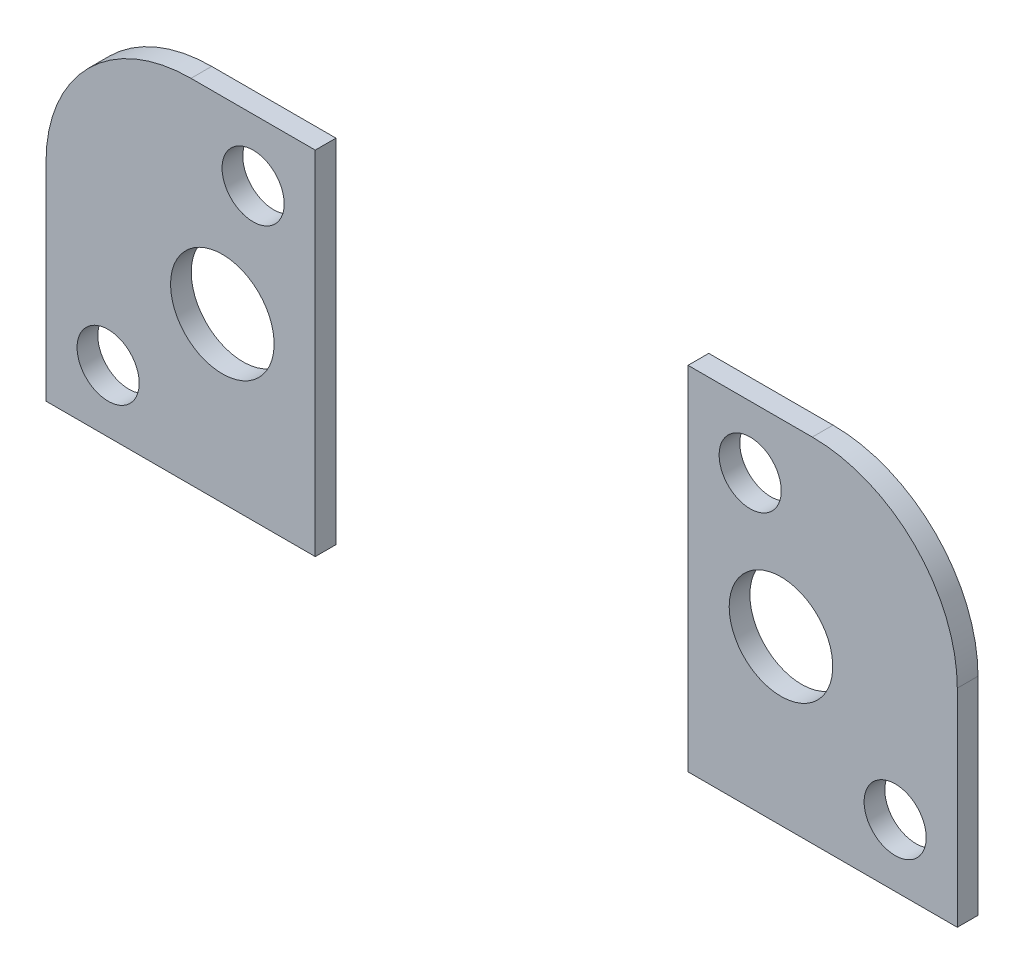
ISO-10303-21;
HEADER;
FILE_DESCRIPTION(('STEP AP214'),'2;1');
FILE_NAME('part.step','',(''),(''),'','','');
FILE_SCHEMA(('AUTOMOTIVE_DESIGN { 1 0 10303 214 1 1 1 1 }'));
ENDSEC;
DATA;
#1=APPLICATION_CONTEXT('core data for automotive mechanical design processes');
#2=APPLICATION_PROTOCOL_DEFINITION('international standard','automotive_design',2000,#1);
#3=PRODUCT_CONTEXT('',#1,'mechanical');
#4=PRODUCT('Part','Part','',(#3));
#5=PRODUCT_RELATED_PRODUCT_CATEGORY('part','',(#4));
#6=PRODUCT_DEFINITION_FORMATION('','',#4);
#7=PRODUCT_DEFINITION_CONTEXT('part definition',#1,'design');
#8=PRODUCT_DEFINITION('design','',#6,#7);
#9=PRODUCT_DEFINITION_SHAPE('','',#8);
#10=(LENGTH_UNIT() NAMED_UNIT(*) SI_UNIT(.MILLI.,.METRE.));
#11=(NAMED_UNIT(*) PLANE_ANGLE_UNIT() SI_UNIT($,.RADIAN.));
#12=(NAMED_UNIT(*) SI_UNIT($,.STERADIAN.) SOLID_ANGLE_UNIT());
#13=UNCERTAINTY_MEASURE_WITH_UNIT(LENGTH_MEASURE(1.E-05),#10,'distance_accuracy_value','');
#14=(GEOMETRIC_REPRESENTATION_CONTEXT(3) GLOBAL_UNCERTAINTY_ASSIGNED_CONTEXT((#13)) GLOBAL_UNIT_ASSIGNED_CONTEXT((#10,
#11,#12)) REPRESENTATION_CONTEXT('',''));
#15=CARTESIAN_POINT('',(0.,0.,0.));
#16=DIRECTION('',(0.,0.,1.));
#17=DIRECTION('',(1.,0.,0.));
#18=AXIS2_PLACEMENT_3D('',#15,#16,#17);
#19=CARTESIAN_POINT('',(-14.6273183885863,0.329507902749218,992.809706350788));
#20=DIRECTION('',(0.,0.,-1.));
#21=DIRECTION('',(-1.,0.,0.));
#22=AXIS2_PLACEMENT_3D('',#19,#20,#21);
#23=PLANE('',#22);
#24=CARTESIAN_POINT('',(-11.6273183885863,4.32950790274922,992.809706350788));
#25=DIRECTION('',(0.,0.,-1.));
#26=DIRECTION('',(-1.,0.,0.));
#27=AXIS2_PLACEMENT_3D('',#24,#25,#26);
#28=CIRCLE('',#27,1.5);
#29=CARTESIAN_POINT('',(-13.1273183885863,4.32950790274922,992.809706350788));
#30=VERTEX_POINT('',#29);
#31=EDGE_CURVE('E145',#30,#30,#28,.T.);
#32=ORIENTED_EDGE('',*,*,#31,.F.);
#33=EDGE_LOOP('',(#32));
#34=FACE_BOUND('',#33,.T.);
#35=DIRECTION('',(1.,0.,0.));
#36=VECTOR('',#35,1.);
#37=CARTESIAN_POINT('',(-14.6273183885863,7.32950790274922,992.809706350788));
#38=LINE('',#37,#36);
#39=CARTESIAN_POINT('',(-14.6273183885863,7.32950790274922,992.809706350788));
#40=VERTEX_POINT('',#39);
#41=CARTESIAN_POINT('',(-8.62731838858626,7.32950790274922,992.809706350788));
#42=VERTEX_POINT('',#41);
#43=EDGE_CURVE('E125',#40,#42,#38,.T.);
#44=ORIENTED_EDGE('',*,*,#43,.T.);
#45=DIRECTION('',(0.,-1.,0.));
#46=VECTOR('',#45,1.);
#47=CARTESIAN_POINT('',(-8.62731838858626,7.32950790274922,992.809706350788));
#48=LINE('',#47,#46);
#49=CARTESIAN_POINT('',(-8.62731838858626,-9.67049209725079,992.809706350788));
#50=VERTEX_POINT('',#49);
#51=EDGE_CURVE('E87',#42,#50,#48,.T.);
#52=ORIENTED_EDGE('',*,*,#51,.T.);
#53=DIRECTION('',(-1.,0.,0.));
#54=VECTOR('',#53,1.);
#55=CARTESIAN_POINT('',(-8.62731838858626,-9.67049209725079,992.809706350788));
#56=LINE('',#55,#54);
#57=CARTESIAN_POINT('',(-21.6273183885863,-9.67049209725079,992.809706350788));
#58=VERTEX_POINT('',#57);
#59=EDGE_CURVE('E138',#50,#58,#56,.T.);
#60=ORIENTED_EDGE('',*,*,#59,.T.);
#61=DIRECTION('',(0.,1.,0.));
#62=VECTOR('',#61,1.);
#63=CARTESIAN_POINT('',(-21.6273183885863,-9.67049209725079,992.809706350788));
#64=LINE('',#63,#62);
#65=CARTESIAN_POINT('',(-21.6273183885863,0.329507902749165,992.809706350788));
#66=VERTEX_POINT('',#65);
#67=EDGE_CURVE('E119',#58,#66,#64,.T.);
#68=ORIENTED_EDGE('',*,*,#67,.T.);
#69=CARTESIAN_POINT('',(-14.6273183885863,0.329507902749218,992.809706350788));
#70=DIRECTION('',(0.,0.,-1.));
#71=DIRECTION('',(-1.,0.,0.));
#72=AXIS2_PLACEMENT_3D('',#69,#70,#71);
#73=CIRCLE('',#72,7.);
#74=EDGE_CURVE('E134',#66,#40,#73,.T.);
#75=ORIENTED_EDGE('',*,*,#74,.T.);
#76=EDGE_LOOP('',(#44,#52,#60,#68,#75));
#77=FACE_BOUND('',#76,.T.);
#78=CARTESIAN_POINT('',(-13.1139784643797,-1.77049209725079,992.809706350788));
#79=DIRECTION('',(0.,0.,-1.));
#80=DIRECTION('',(-1.,0.,0.));
#81=AXIS2_PLACEMENT_3D('',#78,#79,#80);
#82=CIRCLE('',#81,2.5);
#83=CARTESIAN_POINT('',(-15.6139784643797,-1.77049209725079,992.809706350788));
#84=VERTEX_POINT('',#83);
#85=EDGE_CURVE('E133',#84,#84,#82,.T.);
#86=ORIENTED_EDGE('',*,*,#85,.F.);
#87=EDGE_LOOP('',(#86));
#88=FACE_BOUND('',#87,.T.);
#89=CARTESIAN_POINT('',(-18.6273183885863,-6.67049209725079,992.809706350788));
#90=DIRECTION('',(0.,0.,-1.));
#91=DIRECTION('',(-1.,0.,0.));
#92=AXIS2_PLACEMENT_3D('',#89,#90,#91);
#93=CIRCLE('',#92,1.5);
#94=CARTESIAN_POINT('',(-20.1273183885863,-6.67049209725079,992.809706350788));
#95=VERTEX_POINT('',#94);
#96=EDGE_CURVE('E55',#95,#95,#93,.T.);
#97=ORIENTED_EDGE('',*,*,#96,.F.);
#98=EDGE_LOOP('',(#97));
#99=FACE_BOUND('',#98,.T.);
#100=ADVANCED_FACE('F51',(#34,#77,#88,#99),#23,.T.);
#101=CARTESIAN_POINT('',(-14.6273183885863,0.329507902749218,993.809706350788));
#102=DIRECTION('',(0.,0.,-1.));
#103=DIRECTION('',(-1.,0.,0.));
#104=AXIS2_PLACEMENT_3D('',#101,#102,#103);
#105=PLANE('',#104);
#106=DIRECTION('',(1.,0.,0.));
#107=VECTOR('',#106,1.);
#108=CARTESIAN_POINT('',(-14.6273183885863,7.32950790274922,993.809706350788));
#109=LINE('',#108,#107);
#110=CARTESIAN_POINT('',(-14.6273183885863,7.32950790274922,993.809706350788));
#111=VERTEX_POINT('',#110);
#112=CARTESIAN_POINT('',(-8.62731838858626,7.32950790274922,993.809706350788));
#113=VERTEX_POINT('',#112);
#114=EDGE_CURVE('E130',#111,#113,#109,.T.);
#115=ORIENTED_EDGE('',*,*,#114,.F.);
#116=CARTESIAN_POINT('',(-14.6273183885863,0.329507902749218,993.809706350788));
#117=DIRECTION('',(0.,0.,-1.));
#118=DIRECTION('',(-1.,0.,0.));
#119=AXIS2_PLACEMENT_3D('',#116,#117,#118);
#120=CIRCLE('',#119,7.);
#121=CARTESIAN_POINT('',(-21.6273183885863,0.329507902749165,993.809706350788));
#122=VERTEX_POINT('',#121);
#123=EDGE_CURVE('E98',#122,#111,#120,.T.);
#124=ORIENTED_EDGE('',*,*,#123,.F.);
#125=DIRECTION('',(0.,1.,0.));
#126=VECTOR('',#125,1.);
#127=CARTESIAN_POINT('',(-21.6273183885863,-9.67049209725079,993.809706350788));
#128=LINE('',#127,#126);
#129=CARTESIAN_POINT('',(-21.6273183885863,-9.67049209725079,993.809706350788));
#130=VERTEX_POINT('',#129);
#131=EDGE_CURVE('E114',#130,#122,#128,.T.);
#132=ORIENTED_EDGE('',*,*,#131,.F.);
#133=DIRECTION('',(-1.,0.,0.));
#134=VECTOR('',#133,1.);
#135=CARTESIAN_POINT('',(-8.62731838858626,-9.67049209725079,993.809706350788));
#136=LINE('',#135,#134);
#137=CARTESIAN_POINT('',(-8.62731838858626,-9.67049209725079,993.809706350788));
#138=VERTEX_POINT('',#137);
#139=EDGE_CURVE('E106',#138,#130,#136,.T.);
#140=ORIENTED_EDGE('',*,*,#139,.F.);
#141=DIRECTION('',(0.,-1.,0.));
#142=VECTOR('',#141,1.);
#143=CARTESIAN_POINT('',(-8.62731838858626,7.32950790274922,993.809706350788));
#144=LINE('',#143,#142);
#145=EDGE_CURVE('E68',#113,#138,#144,.T.);
#146=ORIENTED_EDGE('',*,*,#145,.F.);
#147=EDGE_LOOP('',(#115,#124,#132,#140,#146));
#148=FACE_BOUND('',#147,.T.);
#149=CARTESIAN_POINT('',(-13.1139784643797,-1.77049209725079,993.809706350788));
#150=DIRECTION('',(0.,0.,-1.));
#151=DIRECTION('',(-1.,0.,0.));
#152=AXIS2_PLACEMENT_3D('',#149,#150,#151);
#153=CIRCLE('',#152,2.5);
#154=CARTESIAN_POINT('',(-15.6139784643797,-1.77049209725079,993.809706350788));
#155=VERTEX_POINT('',#154);
#156=EDGE_CURVE('E142',#155,#155,#153,.T.);
#157=ORIENTED_EDGE('',*,*,#156,.T.);
#158=EDGE_LOOP('',(#157));
#159=FACE_BOUND('',#158,.T.);
#160=CARTESIAN_POINT('',(-11.6273183885863,4.32950790274922,993.809706350788));
#161=DIRECTION('',(0.,0.,-1.));
#162=DIRECTION('',(-1.,0.,0.));
#163=AXIS2_PLACEMENT_3D('',#160,#161,#162);
#164=CIRCLE('',#163,1.5);
#165=CARTESIAN_POINT('',(-13.1273183885863,4.32950790274922,993.809706350788));
#166=VERTEX_POINT('',#165);
#167=EDGE_CURVE('E148',#166,#166,#164,.T.);
#168=ORIENTED_EDGE('',*,*,#167,.T.);
#169=EDGE_LOOP('',(#168));
#170=FACE_BOUND('',#169,.T.);
#171=CARTESIAN_POINT('',(-18.6273183885863,-6.67049209725079,993.809706350788));
#172=DIRECTION('',(0.,0.,-1.));
#173=DIRECTION('',(-1.,0.,0.));
#174=AXIS2_PLACEMENT_3D('',#171,#172,#173);
#175=CIRCLE('',#174,1.5);
#176=CARTESIAN_POINT('',(-20.1273183885863,-6.67049209725079,993.809706350788));
#177=VERTEX_POINT('',#176);
#178=EDGE_CURVE('E12',#177,#177,#175,.T.);
#179=ORIENTED_EDGE('',*,*,#178,.T.);
#180=EDGE_LOOP('',(#179));
#181=FACE_BOUND('',#180,.T.);
#182=ADVANCED_FACE('F122',(#148,#159,#170,#181),#105,.F.);
#183=CARTESIAN_POINT('',(-14.6273183885863,7.32950790274922,992.809706350788));
#184=DIRECTION('',(0.,-1.,0.));
#185=DIRECTION('',(1.,0.,0.));
#186=AXIS2_PLACEMENT_3D('',#183,#184,#185);
#187=PLANE('',#186);
#188=ORIENTED_EDGE('',*,*,#114,.T.);
#189=DIRECTION('',(0.,0.,1.));
#190=VECTOR('',#189,1.);
#191=CARTESIAN_POINT('',(-8.62731838858626,7.32950790274922,992.809706350788));
#192=LINE('',#191,#190);
#193=EDGE_CURVE('E252',#42,#113,#192,.T.);
#194=ORIENTED_EDGE('',*,*,#193,.F.);
#195=ORIENTED_EDGE('',*,*,#43,.F.);
#196=DIRECTION('',(0.,0.,1.));
#197=VECTOR('',#196,1.);
#198=CARTESIAN_POINT('',(-14.6273183885863,7.32950790274922,992.809706350788));
#199=LINE('',#198,#197);
#200=EDGE_CURVE('E136',#40,#111,#199,.T.);
#201=ORIENTED_EDGE('',*,*,#200,.T.);
#202=EDGE_LOOP('',(#188,#194,#195,#201));
#203=FACE_BOUND('',#202,.T.);
#204=ADVANCED_FACE('F172',(#203),#187,.F.);
#205=CARTESIAN_POINT('',(-8.62731838858626,7.32950790274922,992.809706350788));
#206=DIRECTION('',(-1.,0.,0.));
#207=DIRECTION('',(0.,0.,1.));
#208=AXIS2_PLACEMENT_3D('',#205,#206,#207);
#209=PLANE('',#208);
#210=ORIENTED_EDGE('',*,*,#145,.T.);
#211=DIRECTION('',(0.,0.,1.));
#212=VECTOR('',#211,1.);
#213=CARTESIAN_POINT('',(-8.62731838858626,-9.67049209725079,992.809706350788));
#214=LINE('',#213,#212);
#215=EDGE_CURVE('E112',#50,#138,#214,.T.);
#216=ORIENTED_EDGE('',*,*,#215,.F.);
#217=ORIENTED_EDGE('',*,*,#51,.F.);
#218=ORIENTED_EDGE('',*,*,#193,.T.);
#219=EDGE_LOOP('',(#210,#216,#217,#218));
#220=FACE_BOUND('',#219,.T.);
#221=ADVANCED_FACE('F177',(#220),#209,.F.);
#222=CARTESIAN_POINT('',(-8.62731838858626,-9.67049209725079,992.809706350788));
#223=DIRECTION('',(0.,1.,0.));
#224=DIRECTION('',(0.,0.,1.));
#225=AXIS2_PLACEMENT_3D('',#222,#223,#224);
#226=PLANE('',#225);
#227=ORIENTED_EDGE('',*,*,#139,.T.);
#228=DIRECTION('',(0.,0.,1.));
#229=VECTOR('',#228,1.);
#230=CARTESIAN_POINT('',(-21.6273183885863,-9.67049209725079,992.809706350788));
#231=LINE('',#230,#229);
#232=EDGE_CURVE('E110',#58,#130,#231,.T.);
#233=ORIENTED_EDGE('',*,*,#232,.F.);
#234=ORIENTED_EDGE('',*,*,#59,.F.);
#235=ORIENTED_EDGE('',*,*,#215,.T.);
#236=EDGE_LOOP('',(#227,#233,#234,#235));
#237=FACE_BOUND('',#236,.T.);
#238=ADVANCED_FACE('F108',(#237),#226,.F.);
#239=CARTESIAN_POINT('',(-21.6273183885863,-9.67049209725079,992.809706350788));
#240=DIRECTION('',(1.,0.,0.));
#241=DIRECTION('',(0.,1.,0.));
#242=AXIS2_PLACEMENT_3D('',#239,#240,#241);
#243=PLANE('',#242);
#244=ORIENTED_EDGE('',*,*,#131,.T.);
#245=DIRECTION('',(0.,0.,1.));
#246=VECTOR('',#245,1.);
#247=CARTESIAN_POINT('',(-21.6273183885863,0.329507902749165,992.809706350788));
#248=LINE('',#247,#246);
#249=EDGE_CURVE('E120',#66,#122,#248,.T.);
#250=ORIENTED_EDGE('',*,*,#249,.F.);
#251=ORIENTED_EDGE('',*,*,#67,.F.);
#252=ORIENTED_EDGE('',*,*,#232,.T.);
#253=EDGE_LOOP('',(#244,#250,#251,#252));
#254=FACE_BOUND('',#253,.T.);
#255=ADVANCED_FACE('F117',(#254),#243,.F.);
#256=CARTESIAN_POINT('',(-14.6273183885863,0.329507902749218,992.809706350788));
#257=DIRECTION('',(0.,0.,1.));
#258=DIRECTION('',(1.,0.,0.));
#259=AXIS2_PLACEMENT_3D('',#256,#257,#258);
#260=CYLINDRICAL_SURFACE('',#259,7.);
#261=ORIENTED_EDGE('',*,*,#123,.T.);
#262=ORIENTED_EDGE('',*,*,#200,.F.);
#263=ORIENTED_EDGE('',*,*,#74,.F.);
#264=ORIENTED_EDGE('',*,*,#249,.T.);
#265=EDGE_LOOP('',(#261,#262,#263,#264));
#266=FACE_BOUND('',#265,.T.);
#267=ADVANCED_FACE('F181',(#266),#260,.T.);
#268=CARTESIAN_POINT('',(-13.1139784643797,-1.77049209725079,992.809706350788));
#269=DIRECTION('',(0.,0.,1.));
#270=DIRECTION('',(1.,0.,0.));
#271=AXIS2_PLACEMENT_3D('',#268,#269,#270);
#272=CYLINDRICAL_SURFACE('',#271,2.5);
#273=ORIENTED_EDGE('',*,*,#85,.T.);
#274=EDGE_LOOP('',(#273));
#275=FACE_BOUND('',#274,.T.);
#276=ORIENTED_EDGE('',*,*,#156,.F.);
#277=EDGE_LOOP('',(#276));
#278=FACE_BOUND('',#277,.T.);
#279=ADVANCED_FACE('F184',(#275,#278),#272,.F.);
#280=CARTESIAN_POINT('',(-11.6273183885863,4.32950790274922,992.809706350788));
#281=DIRECTION('',(0.,0.,1.));
#282=DIRECTION('',(1.,0.,0.));
#283=AXIS2_PLACEMENT_3D('',#280,#281,#282);
#284=CYLINDRICAL_SURFACE('',#283,1.5);
#285=ORIENTED_EDGE('',*,*,#31,.T.);
#286=EDGE_LOOP('',(#285));
#287=FACE_BOUND('',#286,.T.);
#288=ORIENTED_EDGE('',*,*,#167,.F.);
#289=EDGE_LOOP('',(#288));
#290=FACE_BOUND('',#289,.T.);
#291=ADVANCED_FACE('F154',(#287,#290),#284,.F.);
#292=CARTESIAN_POINT('',(-18.6273183885863,-6.67049209725079,992.809706350788));
#293=DIRECTION('',(0.,0.,1.));
#294=DIRECTION('',(1.,0.,0.));
#295=AXIS2_PLACEMENT_3D('',#292,#293,#294);
#296=CYLINDRICAL_SURFACE('',#295,1.5);
#297=ORIENTED_EDGE('',*,*,#96,.T.);
#298=EDGE_LOOP('',(#297));
#299=FACE_BOUND('',#298,.T.);
#300=ORIENTED_EDGE('',*,*,#178,.F.);
#301=EDGE_LOOP('',(#300));
#302=FACE_BOUND('',#301,.T.);
#303=ADVANCED_FACE('F53',(#299,#302),#296,.F.);
#304=CLOSED_SHELL('',(#100,#182,#204,#221,#238,#255,#267,#279,#291,#303));
#305=MANIFOLD_SOLID_BREP('B2',#304);
#306=CARTESIAN_POINT('',(15.3726816114137,0.329507902749217,992.809706350788));
#307=DIRECTION('',(0.,0.,-1.));
#308=DIRECTION('',(-1.,0.,0.));
#309=AXIS2_PLACEMENT_3D('',#306,#307,#308);
#310=PLANE('',#309);
#311=CARTESIAN_POINT('',(12.3726816114136,4.32950790274922,992.809706350788));
#312=DIRECTION('',(0.,0.,-1.));
#313=DIRECTION('',(-1.,0.,0.));
#314=AXIS2_PLACEMENT_3D('',#311,#312,#313);
#315=CIRCLE('',#314,1.5);
#316=CARTESIAN_POINT('',(10.8726816114136,4.32950790274922,992.809706350788));
#317=VERTEX_POINT('',#316);
#318=EDGE_CURVE('E363',#317,#317,#315,.T.);
#319=ORIENTED_EDGE('',*,*,#318,.F.);
#320=EDGE_LOOP('',(#319));
#321=FACE_BOUND('',#320,.T.);
#322=DIRECTION('',(0.,1.,0.));
#323=VECTOR('',#322,1.);
#324=CARTESIAN_POINT('',(9.37268161141364,-9.67049209725079,992.809706350788));
#325=LINE('',#324,#323);
#326=CARTESIAN_POINT('',(9.37268161141364,-9.67049209725079,992.809706350788));
#327=VERTEX_POINT('',#326);
#328=CARTESIAN_POINT('',(9.37268161141364,7.32950790274922,992.809706350788));
#329=VERTEX_POINT('',#328);
#330=EDGE_CURVE('E350',#327,#329,#325,.T.);
#331=ORIENTED_EDGE('',*,*,#330,.T.);
#332=DIRECTION('',(1.,0.,0.));
#333=VECTOR('',#332,1.);
#334=CARTESIAN_POINT('',(9.37268161141364,7.32950790274922,992.809706350788));
#335=LINE('',#334,#333);
#336=CARTESIAN_POINT('',(15.3726816114137,7.32950790274922,992.809706350788));
#337=VERTEX_POINT('',#336);
#338=EDGE_CURVE('E313',#329,#337,#335,.T.);
#339=ORIENTED_EDGE('',*,*,#338,.T.);
#340=CARTESIAN_POINT('',(15.3726816114137,0.329507902749217,992.809706350788));
#341=DIRECTION('',(0.,0.,-1.));
#342=DIRECTION('',(-1.,0.,0.));
#343=AXIS2_PLACEMENT_3D('',#340,#341,#342);
#344=CIRCLE('',#343,7.);
#345=CARTESIAN_POINT('',(22.3726816114137,0.329507902749168,992.809706350788));
#346=VERTEX_POINT('',#345);
#347=EDGE_CURVE('E317',#337,#346,#344,.T.);
#348=ORIENTED_EDGE('',*,*,#347,.T.);
#349=DIRECTION('',(0.,-1.,0.));
#350=VECTOR('',#349,1.);
#351=CARTESIAN_POINT('',(22.3726816114137,0.329507902749167,992.809706350788));
#352=LINE('',#351,#350);
#353=CARTESIAN_POINT('',(22.3726816114137,-9.67049209725078,992.809706350788));
#354=VERTEX_POINT('',#353);
#355=EDGE_CURVE('E321',#346,#354,#352,.T.);
#356=ORIENTED_EDGE('',*,*,#355,.T.);
#357=DIRECTION('',(-1.,0.,0.));
#358=VECTOR('',#357,1.);
#359=CARTESIAN_POINT('',(22.3726816114137,-9.67049209725078,992.809706350788));
#360=LINE('',#359,#358);
#361=EDGE_CURVE('E281',#354,#327,#360,.T.);
#362=ORIENTED_EDGE('',*,*,#361,.T.);
#363=EDGE_LOOP('',(#331,#339,#348,#356,#362));
#364=FACE_BOUND('',#363,.T.);
#365=CARTESIAN_POINT('',(13.8593416872071,-1.77049209725079,992.809706350788));
#366=DIRECTION('',(0.,0.,-1.));
#367=DIRECTION('',(-1.,0.,0.));
#368=AXIS2_PLACEMENT_3D('',#365,#366,#367);
#369=CIRCLE('',#368,2.5);
#370=CARTESIAN_POINT('',(11.3593416872071,-1.77049209725079,992.809706350788));
#371=VERTEX_POINT('',#370);
#372=EDGE_CURVE('E344',#371,#371,#369,.T.);
#373=ORIENTED_EDGE('',*,*,#372,.F.);
#374=EDGE_LOOP('',(#373));
#375=FACE_BOUND('',#374,.T.);
#376=CARTESIAN_POINT('',(19.3726816114137,-6.67049209725079,992.809706350788));
#377=DIRECTION('',(0.,0.,-1.));
#378=DIRECTION('',(-1.,0.,0.));
#379=AXIS2_PLACEMENT_3D('',#376,#377,#378);
#380=CIRCLE('',#379,1.5);
#381=CARTESIAN_POINT('',(17.8726816114137,-6.67049209725079,992.809706350788));
#382=VERTEX_POINT('',#381);
#383=EDGE_CURVE('E369',#382,#382,#380,.T.);
#384=ORIENTED_EDGE('',*,*,#383,.F.);
#385=EDGE_LOOP('',(#384));
#386=FACE_BOUND('',#385,.T.);
#387=ADVANCED_FACE('F264',(#321,#364,#375,#386),#310,.T.);
#388=CARTESIAN_POINT('',(15.3726816114137,0.329507902749217,993.809706350788));
#389=DIRECTION('',(0.,0.,-1.));
#390=DIRECTION('',(-1.,0.,0.));
#391=AXIS2_PLACEMENT_3D('',#388,#389,#390);
#392=PLANE('',#391);
#393=DIRECTION('',(0.,1.,0.));
#394=VECTOR('',#393,1.);
#395=CARTESIAN_POINT('',(9.37268161141364,-9.67049209725079,993.809706350788));
#396=LINE('',#395,#394);
#397=CARTESIAN_POINT('',(9.37268161141364,-9.67049209725079,993.809706350788));
#398=VERTEX_POINT('',#397);
#399=CARTESIAN_POINT('',(9.37268161141364,7.32950790274922,993.809706350788));
#400=VERTEX_POINT('',#399);
#401=EDGE_CURVE('E340',#398,#400,#396,.T.);
#402=ORIENTED_EDGE('',*,*,#401,.F.);
#403=DIRECTION('',(-1.,0.,0.));
#404=VECTOR('',#403,1.);
#405=CARTESIAN_POINT('',(16.3726816114137,-9.67049209725078,993.809706350788));
#406=LINE('',#405,#404);
#407=CARTESIAN_POINT('',(22.3726816114137,-9.67049209725078,993.809706350788));
#408=VERTEX_POINT('',#407);
#409=EDGE_CURVE('E301',#408,#398,#406,.T.);
#410=ORIENTED_EDGE('',*,*,#409,.F.);
#411=DIRECTION('',(0.,-1.,0.));
#412=VECTOR('',#411,1.);
#413=CARTESIAN_POINT('',(22.3726816114137,0.329507902749167,993.809706350788));
#414=LINE('',#413,#412);
#415=CARTESIAN_POINT('',(22.3726816114137,0.329507902749168,993.809706350788));
#416=VERTEX_POINT('',#415);
#417=EDGE_CURVE('E347',#416,#408,#414,.T.);
#418=ORIENTED_EDGE('',*,*,#417,.F.);
#419=CARTESIAN_POINT('',(15.3726816114137,0.329507902749217,993.809706350788));
#420=DIRECTION('',(0.,0.,-1.));
#421=DIRECTION('',(-1.,0.,0.));
#422=AXIS2_PLACEMENT_3D('',#419,#420,#421);
#423=CIRCLE('',#422,7.);
#424=CARTESIAN_POINT('',(15.3726816114137,7.32950790274922,993.809706350788));
#425=VERTEX_POINT('',#424);
#426=EDGE_CURVE('E330',#425,#416,#423,.T.);
#427=ORIENTED_EDGE('',*,*,#426,.F.);
#428=DIRECTION('',(1.,0.,0.));
#429=VECTOR('',#428,1.);
#430=CARTESIAN_POINT('',(9.37268161141364,7.32950790274922,993.809706350788));
#431=LINE('',#430,#429);
#432=EDGE_CURVE('E343',#400,#425,#431,.T.);
#433=ORIENTED_EDGE('',*,*,#432,.F.);
#434=EDGE_LOOP('',(#402,#410,#418,#427,#433));
#435=FACE_BOUND('',#434,.T.);
#436=CARTESIAN_POINT('',(13.8593416872071,-1.77049209725079,993.809706350788));
#437=DIRECTION('',(0.,0.,-1.));
#438=DIRECTION('',(-1.,0.,0.));
#439=AXIS2_PLACEMENT_3D('',#436,#437,#438);
#440=CIRCLE('',#439,2.5);
#441=CARTESIAN_POINT('',(11.3593416872071,-1.77049209725079,993.809706350788));
#442=VERTEX_POINT('',#441);
#443=EDGE_CURVE('E360',#442,#442,#440,.T.);
#444=ORIENTED_EDGE('',*,*,#443,.T.);
#445=EDGE_LOOP('',(#444));
#446=FACE_BOUND('',#445,.T.);
#447=CARTESIAN_POINT('',(12.3726816114136,4.32950790274922,993.809706350788));
#448=DIRECTION('',(0.,0.,-1.));
#449=DIRECTION('',(-1.,0.,0.));
#450=AXIS2_PLACEMENT_3D('',#447,#448,#449);
#451=CIRCLE('',#450,1.5);
#452=CARTESIAN_POINT('',(10.8726816114136,4.32950790274922,993.809706350788));
#453=VERTEX_POINT('',#452);
#454=EDGE_CURVE('E366',#453,#453,#451,.T.);
#455=ORIENTED_EDGE('',*,*,#454,.T.);
#456=EDGE_LOOP('',(#455));
#457=FACE_BOUND('',#456,.T.);
#458=CARTESIAN_POINT('',(19.3726816114137,-6.67049209725079,993.809706350788));
#459=DIRECTION('',(0.,0.,-1.));
#460=DIRECTION('',(-1.,0.,0.));
#461=AXIS2_PLACEMENT_3D('',#458,#459,#460);
#462=CIRCLE('',#461,1.5);
#463=CARTESIAN_POINT('',(17.8726816114137,-6.67049209725079,993.809706350788));
#464=VERTEX_POINT('',#463);
#465=EDGE_CURVE('E372',#464,#464,#462,.T.);
#466=ORIENTED_EDGE('',*,*,#465,.T.);
#467=EDGE_LOOP('',(#466));
#468=FACE_BOUND('',#467,.T.);
#469=ADVANCED_FACE('F352',(#435,#446,#457,#468),#392,.F.);
#470=CARTESIAN_POINT('',(9.37268161141364,-9.67049209725079,992.809706350788));
#471=DIRECTION('',(1.,0.,0.));
#472=DIRECTION('',(0.,0.,-1.));
#473=AXIS2_PLACEMENT_3D('',#470,#471,#472);
#474=PLANE('',#473);
#475=ORIENTED_EDGE('',*,*,#401,.T.);
#476=DIRECTION('',(0.,0.,1.));
#477=VECTOR('',#476,1.);
#478=CARTESIAN_POINT('',(9.37268161141364,7.32950790274922,992.809706350788));
#479=LINE('',#478,#477);
#480=EDGE_CURVE('E49',#329,#400,#479,.T.);
#481=ORIENTED_EDGE('',*,*,#480,.F.);
#482=ORIENTED_EDGE('',*,*,#330,.F.);
#483=DIRECTION('',(0.,0.,1.));
#484=VECTOR('',#483,1.);
#485=CARTESIAN_POINT('',(9.37268161141364,-9.67049209725079,992.809706350788));
#486=LINE('',#485,#484);
#487=EDGE_CURVE('E336',#327,#398,#486,.T.);
#488=ORIENTED_EDGE('',*,*,#487,.T.);
#489=EDGE_LOOP('',(#475,#481,#482,#488));
#490=FACE_BOUND('',#489,.T.);
#491=ADVANCED_FACE('F266',(#490),#474,.F.);
#492=CARTESIAN_POINT('',(9.37268161141364,7.32950790274922,992.809706350788));
#493=DIRECTION('',(0.,-1.,0.));
#494=DIRECTION('',(0.,0.,-1.));
#495=AXIS2_PLACEMENT_3D('',#492,#493,#494);
#496=PLANE('',#495);
#497=ORIENTED_EDGE('',*,*,#432,.T.);
#498=DIRECTION('',(0.,0.,1.));
#499=VECTOR('',#498,1.);
#500=CARTESIAN_POINT('',(15.3726816114137,7.32950790274922,992.809706350788));
#501=LINE('',#500,#499);
#502=EDGE_CURVE('E273',#337,#425,#501,.T.);
#503=ORIENTED_EDGE('',*,*,#502,.F.);
#504=ORIENTED_EDGE('',*,*,#338,.F.);
#505=ORIENTED_EDGE('',*,*,#480,.T.);
#506=EDGE_LOOP('',(#497,#503,#504,#505));
#507=FACE_BOUND('',#506,.T.);
#508=ADVANCED_FACE('F398',(#507),#496,.F.);
#509=CARTESIAN_POINT('',(15.3726816114137,0.329507902749217,992.809706350788));
#510=DIRECTION('',(0.,0.,1.));
#511=DIRECTION('',(1.,0.,0.));
#512=AXIS2_PLACEMENT_3D('',#509,#510,#511);
#513=CYLINDRICAL_SURFACE('',#512,7.);
#514=ORIENTED_EDGE('',*,*,#426,.T.);
#515=DIRECTION('',(0.,0.,1.));
#516=VECTOR('',#515,1.);
#517=CARTESIAN_POINT('',(22.3726816114137,0.329507902749168,992.809706350788));
#518=LINE('',#517,#516);
#519=EDGE_CURVE('E327',#346,#416,#518,.T.);
#520=ORIENTED_EDGE('',*,*,#519,.F.);
#521=ORIENTED_EDGE('',*,*,#347,.F.);
#522=ORIENTED_EDGE('',*,*,#502,.T.);
#523=EDGE_LOOP('',(#514,#520,#521,#522));
#524=FACE_BOUND('',#523,.T.);
#525=ADVANCED_FACE('F328',(#524),#513,.T.);
#526=CARTESIAN_POINT('',(22.3726816114137,0.329507902749167,992.809706350788));
#527=DIRECTION('',(-1.,0.,0.));
#528=DIRECTION('',(0.,0.,1.));
#529=AXIS2_PLACEMENT_3D('',#526,#527,#528);
#530=PLANE('',#529);
#531=ORIENTED_EDGE('',*,*,#417,.T.);
#532=DIRECTION('',(0.,0.,1.));
#533=VECTOR('',#532,1.);
#534=CARTESIAN_POINT('',(22.3726816114137,-9.67049209725078,992.809706350788));
#535=LINE('',#534,#533);
#536=EDGE_CURVE('E332',#354,#408,#535,.T.);
#537=ORIENTED_EDGE('',*,*,#536,.F.);
#538=ORIENTED_EDGE('',*,*,#355,.F.);
#539=ORIENTED_EDGE('',*,*,#519,.T.);
#540=EDGE_LOOP('',(#531,#537,#538,#539));
#541=FACE_BOUND('',#540,.T.);
#542=ADVANCED_FACE('F334',(#541),#530,.F.);
#543=CARTESIAN_POINT('',(16.3726816114137,-9.67049209725078,992.809706350788));
#544=DIRECTION('',(0.,1.,0.));
#545=DIRECTION('',(-1.,0.,0.));
#546=AXIS2_PLACEMENT_3D('',#543,#544,#545);
#547=PLANE('',#546);
#548=ORIENTED_EDGE('',*,*,#409,.T.);
#549=ORIENTED_EDGE('',*,*,#487,.F.);
#550=ORIENTED_EDGE('',*,*,#361,.F.);
#551=ORIENTED_EDGE('',*,*,#536,.T.);
#552=EDGE_LOOP('',(#548,#549,#550,#551));
#553=FACE_BOUND('',#552,.T.);
#554=ADVANCED_FACE('F354',(#553),#547,.F.);
#555=CARTESIAN_POINT('',(13.8593416872071,-1.77049209725079,992.809706350788));
#556=DIRECTION('',(0.,0.,1.));
#557=DIRECTION('',(1.,0.,0.));
#558=AXIS2_PLACEMENT_3D('',#555,#556,#557);
#559=CYLINDRICAL_SURFACE('',#558,2.5);
#560=ORIENTED_EDGE('',*,*,#372,.T.);
#561=EDGE_LOOP('',(#560));
#562=FACE_BOUND('',#561,.T.);
#563=ORIENTED_EDGE('',*,*,#443,.F.);
#564=EDGE_LOOP('',(#563));
#565=FACE_BOUND('',#564,.T.);
#566=ADVANCED_FACE('F390',(#562,#565),#559,.F.);
#567=CARTESIAN_POINT('',(12.3726816114136,4.32950790274922,992.809706350788));
#568=DIRECTION('',(0.,0.,1.));
#569=DIRECTION('',(1.,0.,0.));
#570=AXIS2_PLACEMENT_3D('',#567,#568,#569);
#571=CYLINDRICAL_SURFACE('',#570,1.5);
#572=ORIENTED_EDGE('',*,*,#318,.T.);
#573=EDGE_LOOP('',(#572));
#574=FACE_BOUND('',#573,.T.);
#575=ORIENTED_EDGE('',*,*,#454,.F.);
#576=EDGE_LOOP('',(#575));
#577=FACE_BOUND('',#576,.T.);
#578=ADVANCED_FACE('F444',(#574,#577),#571,.F.);
#579=CARTESIAN_POINT('',(19.3726816114137,-6.67049209725079,992.809706350788));
#580=DIRECTION('',(0.,0.,1.));
#581=DIRECTION('',(1.,0.,0.));
#582=AXIS2_PLACEMENT_3D('',#579,#580,#581);
#583=CYLINDRICAL_SURFACE('',#582,1.5);
#584=ORIENTED_EDGE('',*,*,#383,.T.);
#585=EDGE_LOOP('',(#584));
#586=FACE_BOUND('',#585,.T.);
#587=ORIENTED_EDGE('',*,*,#465,.F.);
#588=EDGE_LOOP('',(#587));
#589=FACE_BOUND('',#588,.T.);
#590=ADVANCED_FACE('F378',(#586,#589),#583,.F.);
#591=CLOSED_SHELL('',(#387,#469,#491,#508,#525,#542,#554,#566,#578,#590));
#592=MANIFOLD_SOLID_BREP('B6',#591);
#593=ADVANCED_BREP_SHAPE_REPRESENTATION('',(#18,#305,#592),#14);
#594=SHAPE_DEFINITION_REPRESENTATION(#9,#593);
ENDSEC;
END-ISO-10303-21;
